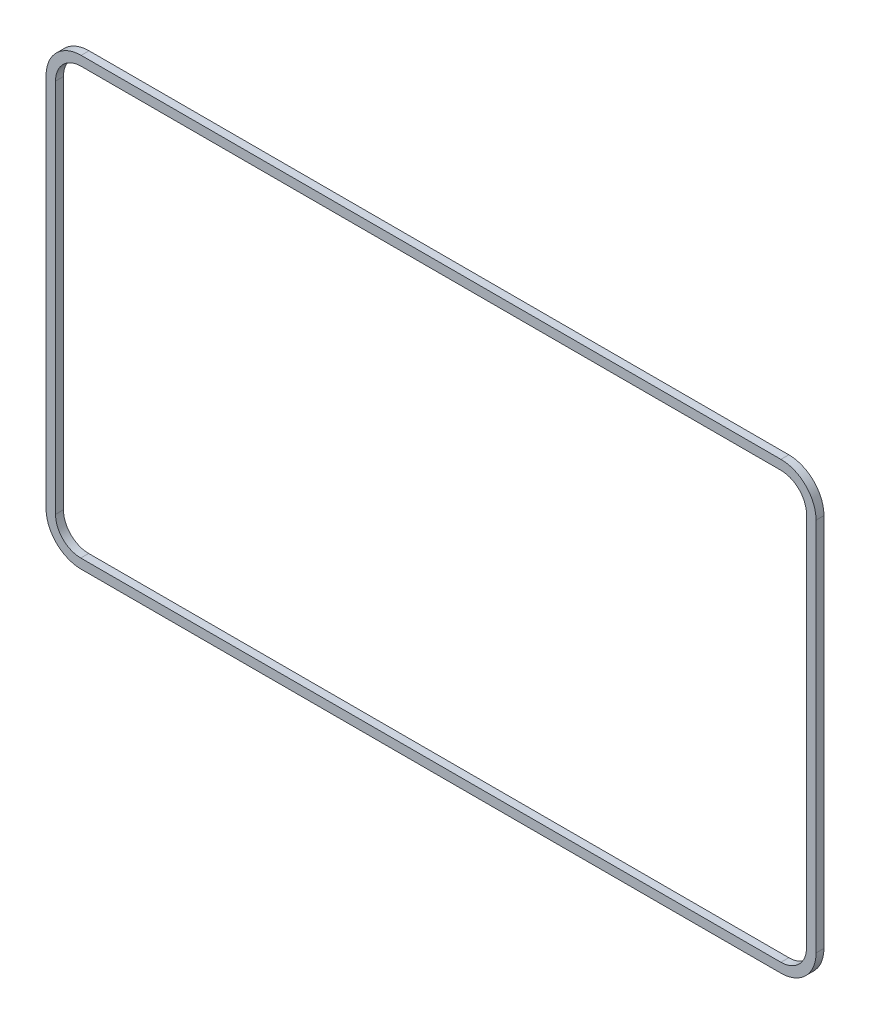
ISO-10303-21;
HEADER;
FILE_DESCRIPTION(('STEP AP214'),'2;1');
FILE_NAME('part.step','',(''),(''),'','','');
FILE_SCHEMA(('AUTOMOTIVE_DESIGN { 1 0 10303 214 1 1 1 1 }'));
ENDSEC;
DATA;
#1=APPLICATION_CONTEXT('core data for automotive mechanical design processes');
#2=APPLICATION_PROTOCOL_DEFINITION('international standard','automotive_design',2000,#1);
#3=PRODUCT_CONTEXT('',#1,'mechanical');
#4=PRODUCT('Part','Part','',(#3));
#5=PRODUCT_RELATED_PRODUCT_CATEGORY('part','',(#4));
#6=PRODUCT_DEFINITION_FORMATION('','',#4);
#7=PRODUCT_DEFINITION_CONTEXT('part definition',#1,'design');
#8=PRODUCT_DEFINITION('design','',#6,#7);
#9=PRODUCT_DEFINITION_SHAPE('','',#8);
#10=(LENGTH_UNIT() NAMED_UNIT(*) SI_UNIT(.MILLI.,.METRE.));
#11=(NAMED_UNIT(*) PLANE_ANGLE_UNIT() SI_UNIT($,.RADIAN.));
#12=(NAMED_UNIT(*) SI_UNIT($,.STERADIAN.) SOLID_ANGLE_UNIT());
#13=UNCERTAINTY_MEASURE_WITH_UNIT(LENGTH_MEASURE(1.E-05),#10,'distance_accuracy_value','');
#14=(GEOMETRIC_REPRESENTATION_CONTEXT(3) GLOBAL_UNCERTAINTY_ASSIGNED_CONTEXT((#13)) GLOBAL_UNIT_ASSIGNED_CONTEXT((#10,
#11,#12)) REPRESENTATION_CONTEXT('',''));
#15=CARTESIAN_POINT('',(0.,0.,0.));
#16=DIRECTION('',(0.,0.,1.));
#17=DIRECTION('',(1.,0.,0.));
#18=AXIS2_PLACEMENT_3D('',#15,#16,#17);
#19=CARTESIAN_POINT('',(88.5,-47.4,2.));
#20=DIRECTION('',(0.,0.,-1.));
#21=DIRECTION('',(-1.,0.,0.));
#22=AXIS2_PLACEMENT_3D('',#19,#20,#21);
#23=PLANE('',#22);
#24=CARTESIAN_POINT('',(88.5,-47.4,2.));
#25=DIRECTION('',(0.,0.,1.));
#26=DIRECTION('',(-1.,0.,0.));
#27=AXIS2_PLACEMENT_3D('',#24,#25,#26);
#28=CIRCLE('',#27,8.88000000000001);
#29=CARTESIAN_POINT('',(88.5,-56.28,2.));
#30=VERTEX_POINT('',#29);
#31=CARTESIAN_POINT('',(97.38,-47.4,2.));
#32=VERTEX_POINT('',#31);
#33=EDGE_CURVE('E210',#30,#32,#28,.T.);
#34=ORIENTED_EDGE('',*,*,#33,.T.);
#35=DIRECTION('',(0.,1.,0.));
#36=VECTOR('',#35,1.);
#37=CARTESIAN_POINT('',(97.38,-47.4,2.));
#38=LINE('',#37,#36);
#39=CARTESIAN_POINT('',(97.38,47.4,2.));
#40=VERTEX_POINT('',#39);
#41=EDGE_CURVE('E213',#32,#40,#38,.T.);
#42=ORIENTED_EDGE('',*,*,#41,.T.);
#43=CARTESIAN_POINT('',(88.5,47.4,2.));
#44=DIRECTION('',(0.,0.,1.));
#45=DIRECTION('',(-1.,0.,0.));
#46=AXIS2_PLACEMENT_3D('',#43,#44,#45);
#47=CIRCLE('',#46,8.88000000000001);
#48=CARTESIAN_POINT('',(88.5,56.28,2.));
#49=VERTEX_POINT('',#48);
#50=EDGE_CURVE('E216',#40,#49,#47,.T.);
#51=ORIENTED_EDGE('',*,*,#50,.T.);
#52=DIRECTION('',(-1.,0.,0.));
#53=VECTOR('',#52,1.);
#54=CARTESIAN_POINT('',(88.5,56.28,2.));
#55=LINE('',#54,#53);
#56=CARTESIAN_POINT('',(-88.5,56.28,2.));
#57=VERTEX_POINT('',#56);
#58=EDGE_CURVE('E218',#49,#57,#55,.T.);
#59=ORIENTED_EDGE('',*,*,#58,.T.);
#60=CARTESIAN_POINT('',(-88.5,47.4,2.));
#61=DIRECTION('',(0.,0.,1.));
#62=DIRECTION('',(-1.,0.,0.));
#63=AXIS2_PLACEMENT_3D('',#60,#61,#62);
#64=CIRCLE('',#63,8.88000000000001);
#65=CARTESIAN_POINT('',(-97.38,47.4,2.));
#66=VERTEX_POINT('',#65);
#67=EDGE_CURVE('E220',#57,#66,#64,.T.);
#68=ORIENTED_EDGE('',*,*,#67,.T.);
#69=DIRECTION('',(0.,-1.,0.));
#70=VECTOR('',#69,1.);
#71=CARTESIAN_POINT('',(-97.38,-47.4,2.));
#72=LINE('',#71,#70);
#73=CARTESIAN_POINT('',(-97.38,-47.4,2.));
#74=VERTEX_POINT('',#73);
#75=EDGE_CURVE('E222',#66,#74,#72,.T.);
#76=ORIENTED_EDGE('',*,*,#75,.T.);
#77=CARTESIAN_POINT('',(-88.5,-47.4,2.));
#78=DIRECTION('',(0.,0.,1.));
#79=DIRECTION('',(-1.,0.,0.));
#80=AXIS2_PLACEMENT_3D('',#77,#78,#79);
#81=CIRCLE('',#80,8.88000000000001);
#82=CARTESIAN_POINT('',(-88.5,-56.28,2.));
#83=VERTEX_POINT('',#82);
#84=EDGE_CURVE('E224',#74,#83,#81,.T.);
#85=ORIENTED_EDGE('',*,*,#84,.T.);
#86=DIRECTION('',(1.,0.,0.));
#87=VECTOR('',#86,1.);
#88=CARTESIAN_POINT('',(88.5,-56.28,2.));
#89=LINE('',#88,#87);
#90=EDGE_CURVE('E226',#83,#30,#89,.T.);
#91=ORIENTED_EDGE('',*,*,#90,.T.);
#92=EDGE_LOOP('',(#34,#42,#51,#59,#68,#76,#85,#91));
#93=FACE_BOUND('',#92,.T.);
#94=CARTESIAN_POINT('',(88.5,-47.4,2.));
#95=DIRECTION('',(0.,0.,1.));
#96=DIRECTION('',(-1.,0.,0.));
#97=AXIS2_PLACEMENT_3D('',#94,#95,#96);
#98=CIRCLE('',#97,6.47999999999999);
#99=CARTESIAN_POINT('',(88.5,-53.88,2.));
#100=VERTEX_POINT('',#99);
#101=CARTESIAN_POINT('',(94.98,-47.4,2.));
#102=VERTEX_POINT('',#101);
#103=EDGE_CURVE('E145',#100,#102,#98,.T.);
#104=ORIENTED_EDGE('',*,*,#103,.F.);
#105=DIRECTION('',(1.,0.,0.));
#106=VECTOR('',#105,1.);
#107=CARTESIAN_POINT('',(88.5,-53.88,2.));
#108=LINE('',#107,#106);
#109=CARTESIAN_POINT('',(-88.6,-53.88,2.));
#110=VERTEX_POINT('',#109);
#111=EDGE_CURVE('E178',#110,#100,#108,.T.);
#112=ORIENTED_EDGE('',*,*,#111,.F.);
#113=CARTESIAN_POINT('',(-88.6,-47.5,2.));
#114=DIRECTION('',(0.,0.,1.));
#115=DIRECTION('',(-1.,0.,0.));
#116=AXIS2_PLACEMENT_3D('',#113,#114,#115);
#117=CIRCLE('',#116,6.38);
#118=CARTESIAN_POINT('',(-94.98,-47.5,2.));
#119=VERTEX_POINT('',#118);
#120=EDGE_CURVE('E176',#119,#110,#117,.T.);
#121=ORIENTED_EDGE('',*,*,#120,.F.);
#122=DIRECTION('',(0.,-1.,0.));
#123=VECTOR('',#122,1.);
#124=CARTESIAN_POINT('',(-94.98,-47.5,2.));
#125=LINE('',#124,#123);
#126=CARTESIAN_POINT('',(-94.98,47.4,2.));
#127=VERTEX_POINT('',#126);
#128=EDGE_CURVE('E174',#127,#119,#125,.T.);
#129=ORIENTED_EDGE('',*,*,#128,.F.);
#130=CARTESIAN_POINT('',(-88.5,47.4,2.));
#131=DIRECTION('',(0.,0.,1.));
#132=DIRECTION('',(-1.,0.,0.));
#133=AXIS2_PLACEMENT_3D('',#130,#131,#132);
#134=CIRCLE('',#133,6.47999999999999);
#135=CARTESIAN_POINT('',(-88.5,53.88,2.));
#136=VERTEX_POINT('',#135);
#137=EDGE_CURVE('E172',#136,#127,#134,.T.);
#138=ORIENTED_EDGE('',*,*,#137,.F.);
#139=DIRECTION('',(-1.,0.,0.));
#140=VECTOR('',#139,1.);
#141=CARTESIAN_POINT('',(88.5,53.88,2.));
#142=LINE('',#141,#140);
#143=CARTESIAN_POINT('',(88.5,53.88,2.));
#144=VERTEX_POINT('',#143);
#145=EDGE_CURVE('E168',#144,#136,#142,.T.);
#146=ORIENTED_EDGE('',*,*,#145,.F.);
#147=CARTESIAN_POINT('',(88.5,47.4,2.));
#148=DIRECTION('',(0.,0.,1.));
#149=DIRECTION('',(-1.,0.,0.));
#150=AXIS2_PLACEMENT_3D('',#147,#148,#149);
#151=CIRCLE('',#150,6.48);
#152=CARTESIAN_POINT('',(94.98,47.4,2.));
#153=VERTEX_POINT('',#152);
#154=EDGE_CURVE('E166',#153,#144,#151,.T.);
#155=ORIENTED_EDGE('',*,*,#154,.F.);
#156=DIRECTION('',(0.,1.,0.));
#157=VECTOR('',#156,1.);
#158=CARTESIAN_POINT('',(94.98,-47.4,2.));
#159=LINE('',#158,#157);
#160=EDGE_CURVE('E153',#102,#153,#159,.T.);
#161=ORIENTED_EDGE('',*,*,#160,.F.);
#162=EDGE_LOOP('',(#104,#112,#121,#129,#138,#146,#155,#161));
#163=FACE_BOUND('',#162,.T.);
#164=ADVANCED_FACE('F32',(#93,#163),#23,.F.);
#165=CARTESIAN_POINT('',(88.5,-47.4,0.));
#166=DIRECTION('',(0.,0.,-1.));
#167=DIRECTION('',(-1.,0.,0.));
#168=AXIS2_PLACEMENT_3D('',#165,#166,#167);
#169=PLANE('',#168);
#170=CARTESIAN_POINT('',(88.5,-47.4,0.));
#171=DIRECTION('',(0.,0.,1.));
#172=DIRECTION('',(-1.,0.,0.));
#173=AXIS2_PLACEMENT_3D('',#170,#171,#172);
#174=CIRCLE('',#173,8.88000000000001);
#175=CARTESIAN_POINT('',(88.5,-56.28,0.));
#176=VERTEX_POINT('',#175);
#177=CARTESIAN_POINT('',(97.38,-47.4,0.));
#178=VERTEX_POINT('',#177);
#179=EDGE_CURVE('E161',#176,#178,#174,.T.);
#180=ORIENTED_EDGE('',*,*,#179,.F.);
#181=DIRECTION('',(1.,0.,0.));
#182=VECTOR('',#181,1.);
#183=CARTESIAN_POINT('',(88.5,-56.28,0.));
#184=LINE('',#183,#182);
#185=CARTESIAN_POINT('',(-88.5,-56.28,0.));
#186=VERTEX_POINT('',#185);
#187=EDGE_CURVE('E214',#186,#176,#184,.T.);
#188=ORIENTED_EDGE('',*,*,#187,.F.);
#189=CARTESIAN_POINT('',(-88.5,-47.4,0.));
#190=DIRECTION('',(0.,0.,1.));
#191=DIRECTION('',(-1.,0.,0.));
#192=AXIS2_PLACEMENT_3D('',#189,#190,#191);
#193=CIRCLE('',#192,8.88000000000001);
#194=CARTESIAN_POINT('',(-97.38,-47.4,0.));
#195=VERTEX_POINT('',#194);
#196=EDGE_CURVE('E241',#195,#186,#193,.T.);
#197=ORIENTED_EDGE('',*,*,#196,.F.);
#198=DIRECTION('',(0.,-1.,0.));
#199=VECTOR('',#198,1.);
#200=CARTESIAN_POINT('',(-97.38,-47.4,0.));
#201=LINE('',#200,#199);
#202=CARTESIAN_POINT('',(-97.38,47.4,0.));
#203=VERTEX_POINT('',#202);
#204=EDGE_CURVE('E239',#203,#195,#201,.T.);
#205=ORIENTED_EDGE('',*,*,#204,.F.);
#206=CARTESIAN_POINT('',(-88.5,47.4,0.));
#207=DIRECTION('',(0.,0.,1.));
#208=DIRECTION('',(-1.,0.,0.));
#209=AXIS2_PLACEMENT_3D('',#206,#207,#208);
#210=CIRCLE('',#209,8.88000000000001);
#211=CARTESIAN_POINT('',(-88.5,56.28,0.));
#212=VERTEX_POINT('',#211);
#213=EDGE_CURVE('E237',#212,#203,#210,.T.);
#214=ORIENTED_EDGE('',*,*,#213,.F.);
#215=DIRECTION('',(-1.,0.,0.));
#216=VECTOR('',#215,1.);
#217=CARTESIAN_POINT('',(88.5,56.28,0.));
#218=LINE('',#217,#216);
#219=CARTESIAN_POINT('',(88.5,56.28,0.));
#220=VERTEX_POINT('',#219);
#221=EDGE_CURVE('E235',#220,#212,#218,.T.);
#222=ORIENTED_EDGE('',*,*,#221,.F.);
#223=CARTESIAN_POINT('',(88.5,47.4,0.));
#224=DIRECTION('',(0.,0.,1.));
#225=DIRECTION('',(-1.,0.,0.));
#226=AXIS2_PLACEMENT_3D('',#223,#224,#225);
#227=CIRCLE('',#226,8.88000000000001);
#228=CARTESIAN_POINT('',(97.38,47.4,0.));
#229=VERTEX_POINT('',#228);
#230=EDGE_CURVE('E233',#229,#220,#227,.T.);
#231=ORIENTED_EDGE('',*,*,#230,.F.);
#232=DIRECTION('',(0.,1.,0.));
#233=VECTOR('',#232,1.);
#234=CARTESIAN_POINT('',(97.38,-47.4,0.));
#235=LINE('',#234,#233);
#236=EDGE_CURVE('E231',#178,#229,#235,.T.);
#237=ORIENTED_EDGE('',*,*,#236,.F.);
#238=EDGE_LOOP('',(#180,#188,#197,#205,#214,#222,#231,#237));
#239=FACE_BOUND('',#238,.T.);
#240=DIRECTION('',(1.,0.,0.));
#241=VECTOR('',#240,1.);
#242=CARTESIAN_POINT('',(88.5,-53.88,0.));
#243=LINE('',#242,#241);
#244=CARTESIAN_POINT('',(-88.6,-53.88,0.));
#245=VERTEX_POINT('',#244);
#246=CARTESIAN_POINT('',(88.5,-53.88,0.));
#247=VERTEX_POINT('',#246);
#248=EDGE_CURVE('E154',#245,#247,#243,.T.);
#249=ORIENTED_EDGE('',*,*,#248,.T.);
#250=CARTESIAN_POINT('',(88.5,-47.4,0.));
#251=DIRECTION('',(0.,0.,1.));
#252=DIRECTION('',(-1.,0.,0.));
#253=AXIS2_PLACEMENT_3D('',#250,#251,#252);
#254=CIRCLE('',#253,6.47999999999999);
#255=CARTESIAN_POINT('',(94.98,-47.4,0.));
#256=VERTEX_POINT('',#255);
#257=EDGE_CURVE('E55',#247,#256,#254,.T.);
#258=ORIENTED_EDGE('',*,*,#257,.T.);
#259=DIRECTION('',(0.,1.,0.));
#260=VECTOR('',#259,1.);
#261=CARTESIAN_POINT('',(94.98,-47.4,0.));
#262=LINE('',#261,#260);
#263=CARTESIAN_POINT('',(94.98,47.4,0.));
#264=VERTEX_POINT('',#263);
#265=EDGE_CURVE('E160',#256,#264,#262,.T.);
#266=ORIENTED_EDGE('',*,*,#265,.T.);
#267=CARTESIAN_POINT('',(88.5,47.4,0.));
#268=DIRECTION('',(0.,0.,1.));
#269=DIRECTION('',(-1.,0.,0.));
#270=AXIS2_PLACEMENT_3D('',#267,#268,#269);
#271=CIRCLE('',#270,6.48);
#272=CARTESIAN_POINT('',(88.5,53.88,0.));
#273=VERTEX_POINT('',#272);
#274=EDGE_CURVE('E182',#264,#273,#271,.T.);
#275=ORIENTED_EDGE('',*,*,#274,.T.);
#276=DIRECTION('',(-1.,0.,0.));
#277=VECTOR('',#276,1.);
#278=CARTESIAN_POINT('',(88.5,53.88,0.));
#279=LINE('',#278,#277);
#280=CARTESIAN_POINT('',(-88.5,53.88,0.));
#281=VERTEX_POINT('',#280);
#282=EDGE_CURVE('E185',#273,#281,#279,.T.);
#283=ORIENTED_EDGE('',*,*,#282,.T.);
#284=CARTESIAN_POINT('',(-88.5,47.4,0.));
#285=DIRECTION('',(0.,0.,1.));
#286=DIRECTION('',(-1.,0.,0.));
#287=AXIS2_PLACEMENT_3D('',#284,#285,#286);
#288=CIRCLE('',#287,6.47999999999999);
#289=CARTESIAN_POINT('',(-94.98,47.4,0.));
#290=VERTEX_POINT('',#289);
#291=EDGE_CURVE('E188',#281,#290,#288,.T.);
#292=ORIENTED_EDGE('',*,*,#291,.T.);
#293=DIRECTION('',(0.,-1.,0.));
#294=VECTOR('',#293,1.);
#295=CARTESIAN_POINT('',(-94.98,-47.5,0.));
#296=LINE('',#295,#294);
#297=CARTESIAN_POINT('',(-94.98,-47.5,0.));
#298=VERTEX_POINT('',#297);
#299=EDGE_CURVE('E191',#290,#298,#296,.T.);
#300=ORIENTED_EDGE('',*,*,#299,.T.);
#301=CARTESIAN_POINT('',(-88.6,-47.5,0.));
#302=DIRECTION('',(0.,0.,1.));
#303=DIRECTION('',(-1.,0.,0.));
#304=AXIS2_PLACEMENT_3D('',#301,#302,#303);
#305=CIRCLE('',#304,6.38);
#306=EDGE_CURVE('E194',#298,#245,#305,.T.);
#307=ORIENTED_EDGE('',*,*,#306,.T.);
#308=EDGE_LOOP('',(#249,#258,#266,#275,#283,#292,#300,#307));
#309=FACE_BOUND('',#308,.T.);
#310=ADVANCED_FACE('F271',(#239,#309),#169,.T.);
#311=CARTESIAN_POINT('',(88.5,-47.4,2.));
#312=DIRECTION('',(0.,0.,-1.));
#313=DIRECTION('',(-1.,0.,0.));
#314=AXIS2_PLACEMENT_3D('',#311,#312,#313);
#315=CYLINDRICAL_SURFACE('',#314,8.88000000000001);
#316=ORIENTED_EDGE('',*,*,#179,.T.);
#317=DIRECTION('',(0.,0.,-1.));
#318=VECTOR('',#317,1.);
#319=CARTESIAN_POINT('',(97.38,-47.4,2.));
#320=LINE('',#319,#318);
#321=EDGE_CURVE('E11',#32,#178,#320,.T.);
#322=ORIENTED_EDGE('',*,*,#321,.F.);
#323=ORIENTED_EDGE('',*,*,#33,.F.);
#324=DIRECTION('',(0.,0.,-1.));
#325=VECTOR('',#324,1.);
#326=CARTESIAN_POINT('',(88.5,-56.28,2.));
#327=LINE('',#326,#325);
#328=EDGE_CURVE('E228',#30,#176,#327,.T.);
#329=ORIENTED_EDGE('',*,*,#328,.T.);
#330=EDGE_LOOP('',(#316,#322,#323,#329));
#331=FACE_BOUND('',#330,.T.);
#332=ADVANCED_FACE('F34',(#331),#315,.T.);
#333=CARTESIAN_POINT('',(97.38,-47.4,2.));
#334=DIRECTION('',(-1.,0.,0.));
#335=DIRECTION('',(0.,0.,1.));
#336=AXIS2_PLACEMENT_3D('',#333,#334,#335);
#337=PLANE('',#336);
#338=ORIENTED_EDGE('',*,*,#236,.T.);
#339=DIRECTION('',(0.,0.,-1.));
#340=VECTOR('',#339,1.);
#341=CARTESIAN_POINT('',(97.38,47.4,2.));
#342=LINE('',#341,#340);
#343=EDGE_CURVE('E40',#40,#229,#342,.T.);
#344=ORIENTED_EDGE('',*,*,#343,.F.);
#345=ORIENTED_EDGE('',*,*,#41,.F.);
#346=ORIENTED_EDGE('',*,*,#321,.T.);
#347=EDGE_LOOP('',(#338,#344,#345,#346));
#348=FACE_BOUND('',#347,.T.);
#349=ADVANCED_FACE('F288',(#348),#337,.F.);
#350=CARTESIAN_POINT('',(88.5,47.4,2.));
#351=DIRECTION('',(0.,0.,-1.));
#352=DIRECTION('',(-1.,0.,0.));
#353=AXIS2_PLACEMENT_3D('',#350,#351,#352);
#354=CYLINDRICAL_SURFACE('',#353,8.88000000000001);
#355=ORIENTED_EDGE('',*,*,#230,.T.);
#356=DIRECTION('',(0.,0.,-1.));
#357=VECTOR('',#356,1.);
#358=CARTESIAN_POINT('',(88.5,56.28,2.));
#359=LINE('',#358,#357);
#360=EDGE_CURVE('E258',#49,#220,#359,.T.);
#361=ORIENTED_EDGE('',*,*,#360,.F.);
#362=ORIENTED_EDGE('',*,*,#50,.F.);
#363=ORIENTED_EDGE('',*,*,#343,.T.);
#364=EDGE_LOOP('',(#355,#361,#362,#363));
#365=FACE_BOUND('',#364,.T.);
#366=ADVANCED_FACE('F265',(#365),#354,.T.);
#367=CARTESIAN_POINT('',(88.5,56.28,2.));
#368=DIRECTION('',(0.,-1.,0.));
#369=DIRECTION('',(0.,0.,-1.));
#370=AXIS2_PLACEMENT_3D('',#367,#368,#369);
#371=PLANE('',#370);
#372=ORIENTED_EDGE('',*,*,#221,.T.);
#373=DIRECTION('',(0.,0.,-1.));
#374=VECTOR('',#373,1.);
#375=CARTESIAN_POINT('',(-88.5,56.28,2.));
#376=LINE('',#375,#374);
#377=EDGE_CURVE('E255',#57,#212,#376,.T.);
#378=ORIENTED_EDGE('',*,*,#377,.F.);
#379=ORIENTED_EDGE('',*,*,#58,.F.);
#380=ORIENTED_EDGE('',*,*,#360,.T.);
#381=EDGE_LOOP('',(#372,#378,#379,#380));
#382=FACE_BOUND('',#381,.T.);
#383=ADVANCED_FACE('F277',(#382),#371,.F.);
#384=CARTESIAN_POINT('',(-88.5,47.4,2.));
#385=DIRECTION('',(0.,0.,-1.));
#386=DIRECTION('',(-1.,0.,0.));
#387=AXIS2_PLACEMENT_3D('',#384,#385,#386);
#388=CYLINDRICAL_SURFACE('',#387,8.88000000000001);
#389=ORIENTED_EDGE('',*,*,#213,.T.);
#390=DIRECTION('',(0.,0.,-1.));
#391=VECTOR('',#390,1.);
#392=CARTESIAN_POINT('',(-97.38,47.4,2.));
#393=LINE('',#392,#391);
#394=EDGE_CURVE('E252',#66,#203,#393,.T.);
#395=ORIENTED_EDGE('',*,*,#394,.F.);
#396=ORIENTED_EDGE('',*,*,#67,.F.);
#397=ORIENTED_EDGE('',*,*,#377,.T.);
#398=EDGE_LOOP('',(#389,#395,#396,#397));
#399=FACE_BOUND('',#398,.T.);
#400=ADVANCED_FACE('F281',(#399),#388,.T.);
#401=CARTESIAN_POINT('',(-97.38,-47.4,2.));
#402=DIRECTION('',(1.,0.,0.));
#403=DIRECTION('',(0.,0.,-1.));
#404=AXIS2_PLACEMENT_3D('',#401,#402,#403);
#405=PLANE('',#404);
#406=ORIENTED_EDGE('',*,*,#204,.T.);
#407=DIRECTION('',(0.,0.,-1.));
#408=VECTOR('',#407,1.);
#409=CARTESIAN_POINT('',(-97.38,-47.4,2.));
#410=LINE('',#409,#408);
#411=EDGE_CURVE('E249',#74,#195,#410,.T.);
#412=ORIENTED_EDGE('',*,*,#411,.F.);
#413=ORIENTED_EDGE('',*,*,#75,.F.);
#414=ORIENTED_EDGE('',*,*,#394,.T.);
#415=EDGE_LOOP('',(#406,#412,#413,#414));
#416=FACE_BOUND('',#415,.T.);
#417=ADVANCED_FACE('F301',(#416),#405,.F.);
#418=CARTESIAN_POINT('',(-88.5,-47.4,2.));
#419=DIRECTION('',(0.,0.,-1.));
#420=DIRECTION('',(-1.,0.,0.));
#421=AXIS2_PLACEMENT_3D('',#418,#419,#420);
#422=CYLINDRICAL_SURFACE('',#421,8.88000000000001);
#423=ORIENTED_EDGE('',*,*,#196,.T.);
#424=DIRECTION('',(0.,0.,-1.));
#425=VECTOR('',#424,1.);
#426=CARTESIAN_POINT('',(-88.5,-56.28,2.));
#427=LINE('',#426,#425);
#428=EDGE_CURVE('E246',#83,#186,#427,.T.);
#429=ORIENTED_EDGE('',*,*,#428,.F.);
#430=ORIENTED_EDGE('',*,*,#84,.F.);
#431=ORIENTED_EDGE('',*,*,#411,.T.);
#432=EDGE_LOOP('',(#423,#429,#430,#431));
#433=FACE_BOUND('',#432,.T.);
#434=ADVANCED_FACE('F299',(#433),#422,.T.);
#435=CARTESIAN_POINT('',(88.5,-56.28,2.));
#436=DIRECTION('',(0.,1.,0.));
#437=DIRECTION('',(0.,0.,1.));
#438=AXIS2_PLACEMENT_3D('',#435,#436,#437);
#439=PLANE('',#438);
#440=ORIENTED_EDGE('',*,*,#187,.T.);
#441=ORIENTED_EDGE('',*,*,#328,.F.);
#442=ORIENTED_EDGE('',*,*,#90,.F.);
#443=ORIENTED_EDGE('',*,*,#428,.T.);
#444=EDGE_LOOP('',(#440,#441,#442,#443));
#445=FACE_BOUND('',#444,.T.);
#446=ADVANCED_FACE('F294',(#445),#439,.F.);
#447=CARTESIAN_POINT('',(88.5,-47.4,2.));
#448=DIRECTION('',(0.,0.,-1.));
#449=DIRECTION('',(-1.,0.,0.));
#450=AXIS2_PLACEMENT_3D('',#447,#448,#449);
#451=CYLINDRICAL_SURFACE('',#450,6.47999999999999);
#452=ORIENTED_EDGE('',*,*,#257,.F.);
#453=DIRECTION('',(0.,0.,-1.));
#454=VECTOR('',#453,1.);
#455=CARTESIAN_POINT('',(88.5,-53.88,2.));
#456=LINE('',#455,#454);
#457=EDGE_CURVE('E149',#100,#247,#456,.T.);
#458=ORIENTED_EDGE('',*,*,#457,.F.);
#459=ORIENTED_EDGE('',*,*,#103,.T.);
#460=DIRECTION('',(0.,0.,-1.));
#461=VECTOR('',#460,1.);
#462=CARTESIAN_POINT('',(94.98,-47.4,2.));
#463=LINE('',#462,#461);
#464=EDGE_CURVE('E148',#102,#256,#463,.T.);
#465=ORIENTED_EDGE('',*,*,#464,.T.);
#466=EDGE_LOOP('',(#452,#458,#459,#465));
#467=FACE_BOUND('',#466,.T.);
#468=ADVANCED_FACE('F147',(#467),#451,.F.);
#469=CARTESIAN_POINT('',(94.98,-47.4,2.));
#470=DIRECTION('',(-1.,0.,0.));
#471=DIRECTION('',(0.,0.,1.));
#472=AXIS2_PLACEMENT_3D('',#469,#470,#471);
#473=PLANE('',#472);
#474=ORIENTED_EDGE('',*,*,#265,.F.);
#475=ORIENTED_EDGE('',*,*,#464,.F.);
#476=ORIENTED_EDGE('',*,*,#160,.T.);
#477=DIRECTION('',(0.,0.,-1.));
#478=VECTOR('',#477,1.);
#479=CARTESIAN_POINT('',(94.98,47.4,2.));
#480=LINE('',#479,#478);
#481=EDGE_CURVE('E162',#153,#264,#480,.T.);
#482=ORIENTED_EDGE('',*,*,#481,.T.);
#483=EDGE_LOOP('',(#474,#475,#476,#482));
#484=FACE_BOUND('',#483,.T.);
#485=ADVANCED_FACE('F157',(#484),#473,.T.);
#486=CARTESIAN_POINT('',(88.5,47.4,2.));
#487=DIRECTION('',(0.,0.,-1.));
#488=DIRECTION('',(-1.,0.,0.));
#489=AXIS2_PLACEMENT_3D('',#486,#487,#488);
#490=CYLINDRICAL_SURFACE('',#489,6.48);
#491=ORIENTED_EDGE('',*,*,#274,.F.);
#492=ORIENTED_EDGE('',*,*,#481,.F.);
#493=ORIENTED_EDGE('',*,*,#154,.T.);
#494=DIRECTION('',(0.,0.,-1.));
#495=VECTOR('',#494,1.);
#496=CARTESIAN_POINT('',(88.5,53.88,2.));
#497=LINE('',#496,#495);
#498=EDGE_CURVE('E207',#144,#273,#497,.T.);
#499=ORIENTED_EDGE('',*,*,#498,.T.);
#500=EDGE_LOOP('',(#491,#492,#493,#499));
#501=FACE_BOUND('',#500,.T.);
#502=ADVANCED_FACE('F326',(#501),#490,.F.);
#503=CARTESIAN_POINT('',(88.5,53.88,2.));
#504=DIRECTION('',(0.,-1.,0.));
#505=DIRECTION('',(0.,0.,-1.));
#506=AXIS2_PLACEMENT_3D('',#503,#504,#505);
#507=PLANE('',#506);
#508=ORIENTED_EDGE('',*,*,#282,.F.);
#509=ORIENTED_EDGE('',*,*,#498,.F.);
#510=ORIENTED_EDGE('',*,*,#145,.T.);
#511=DIRECTION('',(0.,0.,-1.));
#512=VECTOR('',#511,1.);
#513=CARTESIAN_POINT('',(-88.5,53.88,2.));
#514=LINE('',#513,#512);
#515=EDGE_CURVE('E205',#136,#281,#514,.T.);
#516=ORIENTED_EDGE('',*,*,#515,.T.);
#517=EDGE_LOOP('',(#508,#509,#510,#516));
#518=FACE_BOUND('',#517,.T.);
#519=ADVANCED_FACE('F330',(#518),#507,.T.);
#520=CARTESIAN_POINT('',(-88.5,47.4,2.));
#521=DIRECTION('',(0.,0.,-1.));
#522=DIRECTION('',(-1.,0.,0.));
#523=AXIS2_PLACEMENT_3D('',#520,#521,#522);
#524=CYLINDRICAL_SURFACE('',#523,6.47999999999999);
#525=ORIENTED_EDGE('',*,*,#291,.F.);
#526=ORIENTED_EDGE('',*,*,#515,.F.);
#527=ORIENTED_EDGE('',*,*,#137,.T.);
#528=DIRECTION('',(0.,0.,-1.));
#529=VECTOR('',#528,1.);
#530=CARTESIAN_POINT('',(-94.98,47.4,2.));
#531=LINE('',#530,#529);
#532=EDGE_CURVE('E203',#127,#290,#531,.T.);
#533=ORIENTED_EDGE('',*,*,#532,.T.);
#534=EDGE_LOOP('',(#525,#526,#527,#533));
#535=FACE_BOUND('',#534,.T.);
#536=ADVANCED_FACE('F336',(#535),#524,.F.);
#537=CARTESIAN_POINT('',(-94.98,-47.5,2.));
#538=DIRECTION('',(1.,0.,0.));
#539=DIRECTION('',(0.,0.,-1.));
#540=AXIS2_PLACEMENT_3D('',#537,#538,#539);
#541=PLANE('',#540);
#542=ORIENTED_EDGE('',*,*,#299,.F.);
#543=ORIENTED_EDGE('',*,*,#532,.F.);
#544=ORIENTED_EDGE('',*,*,#128,.T.);
#545=DIRECTION('',(0.,0.,-1.));
#546=VECTOR('',#545,1.);
#547=CARTESIAN_POINT('',(-94.98,-47.5,2.));
#548=LINE('',#547,#546);
#549=EDGE_CURVE('E201',#119,#298,#548,.T.);
#550=ORIENTED_EDGE('',*,*,#549,.T.);
#551=EDGE_LOOP('',(#542,#543,#544,#550));
#552=FACE_BOUND('',#551,.T.);
#553=ADVANCED_FACE('F340',(#552),#541,.T.);
#554=CARTESIAN_POINT('',(-88.6,-47.5,2.));
#555=DIRECTION('',(0.,0.,-1.));
#556=DIRECTION('',(-1.,0.,0.));
#557=AXIS2_PLACEMENT_3D('',#554,#555,#556);
#558=CYLINDRICAL_SURFACE('',#557,6.38);
#559=ORIENTED_EDGE('',*,*,#306,.F.);
#560=ORIENTED_EDGE('',*,*,#549,.F.);
#561=ORIENTED_EDGE('',*,*,#120,.T.);
#562=DIRECTION('',(0.,0.,-1.));
#563=VECTOR('',#562,1.);
#564=CARTESIAN_POINT('',(-88.6,-53.88,2.));
#565=LINE('',#564,#563);
#566=EDGE_CURVE('E47',#110,#245,#565,.T.);
#567=ORIENTED_EDGE('',*,*,#566,.T.);
#568=EDGE_LOOP('',(#559,#560,#561,#567));
#569=FACE_BOUND('',#568,.T.);
#570=ADVANCED_FACE('F344',(#569),#558,.F.);
#571=CARTESIAN_POINT('',(88.5,-53.88,2.));
#572=DIRECTION('',(0.,1.,0.));
#573=DIRECTION('',(0.,0.,1.));
#574=AXIS2_PLACEMENT_3D('',#571,#572,#573);
#575=PLANE('',#574);
#576=ORIENTED_EDGE('',*,*,#248,.F.);
#577=ORIENTED_EDGE('',*,*,#566,.F.);
#578=ORIENTED_EDGE('',*,*,#111,.T.);
#579=ORIENTED_EDGE('',*,*,#457,.T.);
#580=EDGE_LOOP('',(#576,#577,#578,#579));
#581=FACE_BOUND('',#580,.T.);
#582=ADVANCED_FACE('F348',(#581),#575,.T.);
#583=CLOSED_SHELL('',(#164,#310,#332,#349,#366,#383,#400,#417,#434,#446,#468,#485,#502,#519,
#536,#553,#570,#582));
#584=MANIFOLD_SOLID_BREP('B2',#583);
#585=ADVANCED_BREP_SHAPE_REPRESENTATION('',(#18,#584),#14);
#586=SHAPE_DEFINITION_REPRESENTATION(#9,#585);
ENDSEC;
END-ISO-10303-21;
